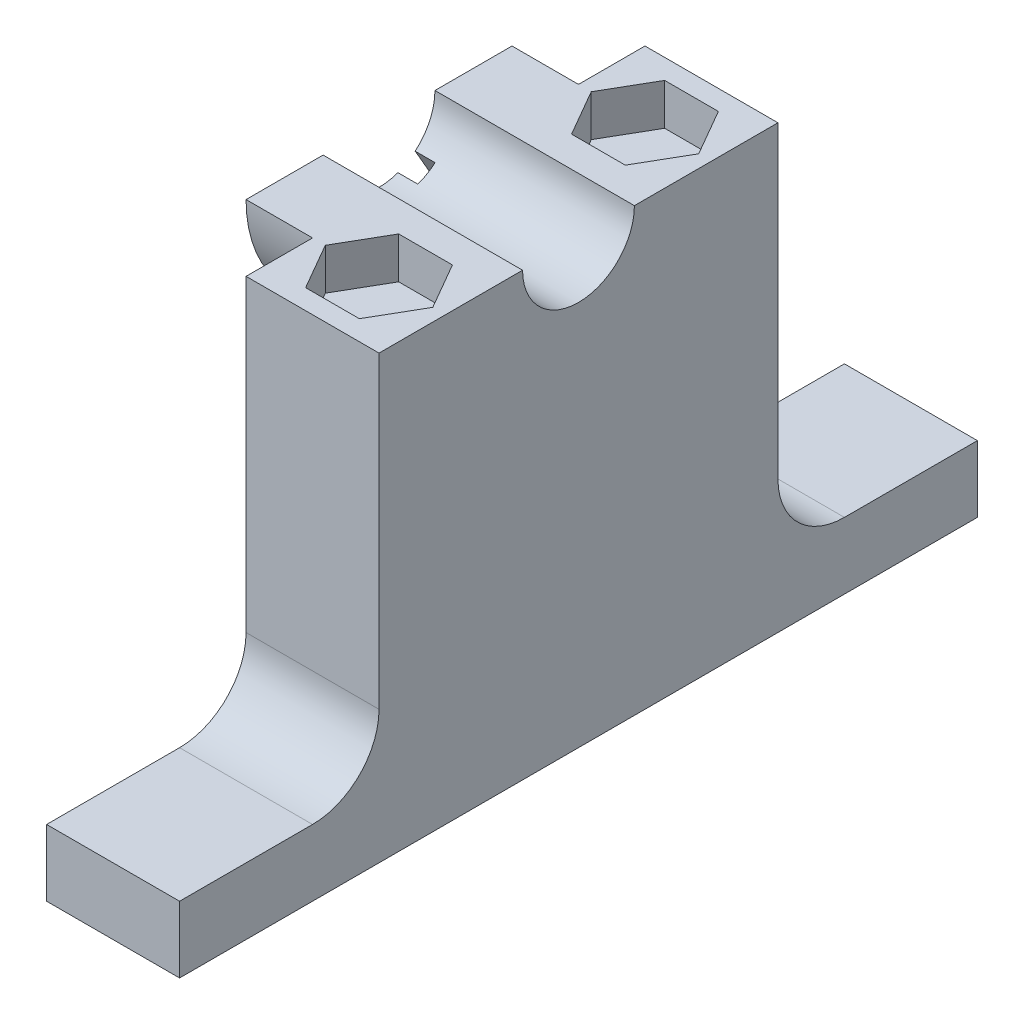
ISO-10303-21;
HEADER;
FILE_DESCRIPTION(('STEP AP214'),'2;1');
FILE_NAME('part.step','',(''),(''),'','','');
FILE_SCHEMA(('AUTOMOTIVE_DESIGN { 1 0 10303 214 1 1 1 1 }'));
ENDSEC;
DATA;
#1=APPLICATION_CONTEXT('core data for automotive mechanical design processes');
#2=APPLICATION_PROTOCOL_DEFINITION('international standard','automotive_design',2000,#1);
#3=PRODUCT_CONTEXT('',#1,'mechanical');
#4=PRODUCT('Part','Part','',(#3));
#5=PRODUCT_RELATED_PRODUCT_CATEGORY('part','',(#4));
#6=PRODUCT_DEFINITION_FORMATION('','',#4);
#7=PRODUCT_DEFINITION_CONTEXT('part definition',#1,'design');
#8=PRODUCT_DEFINITION('design','',#6,#7);
#9=PRODUCT_DEFINITION_SHAPE('','',#8);
#10=(LENGTH_UNIT() NAMED_UNIT(*) SI_UNIT(.MILLI.,.METRE.));
#11=(NAMED_UNIT(*) PLANE_ANGLE_UNIT() SI_UNIT($,.RADIAN.));
#12=(NAMED_UNIT(*) SI_UNIT($,.STERADIAN.) SOLID_ANGLE_UNIT());
#13=UNCERTAINTY_MEASURE_WITH_UNIT(LENGTH_MEASURE(1.E-05),#10,'distance_accuracy_value','');
#14=(GEOMETRIC_REPRESENTATION_CONTEXT(3) GLOBAL_UNCERTAINTY_ASSIGNED_CONTEXT((#13)) GLOBAL_UNIT_ASSIGNED_CONTEXT((#10,
#11,#12)) REPRESENTATION_CONTEXT('',''));
#15=CARTESIAN_POINT('',(0.,0.,0.));
#16=DIRECTION('',(0.,0.,1.));
#17=DIRECTION('',(1.,0.,0.));
#18=AXIS2_PLACEMENT_3D('',#15,#16,#17);
#19=CARTESIAN_POINT('',(5.,33.2,0.));
#20=DIRECTION('',(-1.,0.,0.));
#21=DIRECTION('',(0.,0.,1.));
#22=AXIS2_PLACEMENT_3D('',#19,#20,#21);
#23=CYLINDRICAL_SURFACE('',#22,4.205);
#24=DIRECTION('',(-1.,0.,0.));
#25=VECTOR('',#24,1.);
#26=CARTESIAN_POINT('',(5.,29.991755136751,-2.71830643920743));
#27=LINE('',#26,#25);
#28=CARTESIAN_POINT('',(-8.5,29.991755136751,-2.71830643920743));
#29=VERTEX_POINT('',#28);
#30=CARTESIAN_POINT('',(-10.,29.991755136751,-2.71830643920743));
#31=VERTEX_POINT('',#30);
#32=EDGE_CURVE('E280',#29,#31,#27,.T.);
#33=ORIENTED_EDGE('',*,*,#32,.F.);
#34=CARTESIAN_POINT('',(-8.5,33.2,0.));
#35=DIRECTION('',(1.,0.,0.));
#36=DIRECTION('',(0.,0.,-1.));
#37=AXIS2_PLACEMENT_3D('',#34,#35,#36);
#38=CIRCLE('',#37,4.205);
#39=CARTESIAN_POINT('',(-8.5,29.241755136751,-1.41926833353077));
#40=VERTEX_POINT('',#39);
#41=EDGE_CURVE('E274',#29,#40,#38,.F.);
#42=ORIENTED_EDGE('',*,*,#41,.T.);
#43=DIRECTION('',(-1.,0.,0.));
#44=VECTOR('',#43,1.);
#45=CARTESIAN_POINT('',(5.,29.241755136751,-1.41926833353077));
#46=LINE('',#45,#44);
#47=CARTESIAN_POINT('',(-10.,29.241755136751,-1.41926833353077));
#48=VERTEX_POINT('',#47);
#49=EDGE_CURVE('E260',#40,#48,#46,.T.);
#50=ORIENTED_EDGE('',*,*,#49,.T.);
#51=CARTESIAN_POINT('',(-10.,33.2,0.));
#52=DIRECTION('',(1.,0.,0.));
#53=DIRECTION('',(0.,0.,1.));
#54=AXIS2_PLACEMENT_3D('',#51,#52,#53);
#55=CIRCLE('',#54,4.205);
#56=CARTESIAN_POINT('',(-10.,29.241755136751,1.41926833353078));
#57=VERTEX_POINT('',#56);
#58=EDGE_CURVE('E306',#57,#48,#55,.T.);
#59=ORIENTED_EDGE('',*,*,#58,.F.);
#60=DIRECTION('',(-1.,0.,0.));
#61=VECTOR('',#60,1.);
#62=CARTESIAN_POINT('',(5.,29.241755136751,1.41926833353078));
#63=LINE('',#62,#61);
#64=CARTESIAN_POINT('',(-8.5,29.241755136751,1.41926833353078));
#65=VERTEX_POINT('',#64);
#66=EDGE_CURVE('E296',#65,#57,#63,.T.);
#67=ORIENTED_EDGE('',*,*,#66,.F.);
#68=CARTESIAN_POINT('',(-8.5,33.2,0.));
#69=DIRECTION('',(1.,0.,0.));
#70=DIRECTION('',(0.,0.,-1.));
#71=AXIS2_PLACEMENT_3D('',#68,#69,#70);
#72=CIRCLE('',#71,4.205);
#73=CARTESIAN_POINT('',(-8.5,29.991755136751,2.71830643920744));
#74=VERTEX_POINT('',#73);
#75=EDGE_CURVE('E298',#65,#74,#72,.F.);
#76=ORIENTED_EDGE('',*,*,#75,.T.);
#77=DIRECTION('',(-1.,0.,0.));
#78=VECTOR('',#77,1.);
#79=CARTESIAN_POINT('',(5.,29.991755136751,2.71830643920744));
#80=LINE('',#79,#78);
#81=CARTESIAN_POINT('',(-10.,29.991755136751,2.71830643920744));
#82=VERTEX_POINT('',#81);
#83=EDGE_CURVE('E291',#74,#82,#80,.T.);
#84=ORIENTED_EDGE('',*,*,#83,.T.);
#85=CARTESIAN_POINT('',(-10.,33.2,4.205));
#86=VERTEX_POINT('',#85);
#87=EDGE_CURVE('E302',#86,#82,#55,.T.);
#88=ORIENTED_EDGE('',*,*,#87,.F.);
#89=DIRECTION('',(-1.,0.,0.));
#90=VECTOR('',#89,1.);
#91=CARTESIAN_POINT('',(5.,33.2,4.205));
#92=LINE('',#91,#90);
#93=CARTESIAN_POINT('',(5.,33.2,4.205));
#94=VERTEX_POINT('',#93);
#95=EDGE_CURVE('E482',#94,#86,#92,.T.);
#96=ORIENTED_EDGE('',*,*,#95,.F.);
#97=CARTESIAN_POINT('',(5.,33.2,0.));
#98=DIRECTION('',(-1.,0.,0.));
#99=DIRECTION('',(0.,0.,1.));
#100=AXIS2_PLACEMENT_3D('',#97,#98,#99);
#101=CIRCLE('',#100,4.205);
#102=CARTESIAN_POINT('',(5.,33.2,-4.205));
#103=VERTEX_POINT('',#102);
#104=EDGE_CURVE('E438',#103,#94,#101,.T.);
#105=ORIENTED_EDGE('',*,*,#104,.F.);
#106=DIRECTION('',(-1.,0.,0.));
#107=VECTOR('',#106,1.);
#108=CARTESIAN_POINT('',(5.,33.2,-4.205));
#109=LINE('',#108,#107);
#110=CARTESIAN_POINT('',(-10.,33.2,-4.205));
#111=VERTEX_POINT('',#110);
#112=EDGE_CURVE('E479',#111,#103,#109,.F.);
#113=ORIENTED_EDGE('',*,*,#112,.F.);
#114=EDGE_CURVE('E307',#31,#111,#55,.T.);
#115=ORIENTED_EDGE('',*,*,#114,.F.);
#116=EDGE_LOOP('',(#33,#42,#50,#59,#67,#76,#84,#88,#96,#105,#113,#115));
#117=FACE_BOUND('',#116,.T.);
#118=ADVANCED_FACE('F39',(#117),#23,.F.);
#119=CARTESIAN_POINT('',(-10.,33.2,0.));
#120=DIRECTION('',(1.,0.,0.));
#121=DIRECTION('',(0.,0.,-1.));
#122=AXIS2_PLACEMENT_3D('',#119,#120,#121);
#123=CYLINDRICAL_SURFACE('',#122,10.);
#124=DIRECTION('',(1.,0.,0.));
#125=VECTOR('',#124,1.);
#126=CARTESIAN_POINT('',(-10.,24.939137275292,-5.63543672163306));
#127=LINE('',#126,#125);
#128=CARTESIAN_POINT('',(-10.,24.939137275292,-5.63543672163306));
#129=VERTEX_POINT('',#128);
#130=CARTESIAN_POINT('',(-8.5,24.939137275292,-5.63543672163306));
#131=VERTEX_POINT('',#130);
#132=EDGE_CURVE('E269',#129,#131,#127,.T.);
#133=ORIENTED_EDGE('',*,*,#132,.F.);
#134=CARTESIAN_POINT('',(-10.,33.2,0.));
#135=DIRECTION('',(-1.,0.,0.));
#136=DIRECTION('',(0.,0.,1.));
#137=AXIS2_PLACEMENT_3D('',#134,#135,#136);
#138=CIRCLE('',#137,10.);
#139=CARTESIAN_POINT('',(-10.,33.2,-10.));
#140=VERTEX_POINT('',#139);
#141=EDGE_CURVE('E310',#140,#129,#138,.T.);
#142=ORIENTED_EDGE('',*,*,#141,.F.);
#143=DIRECTION('',(1.,0.,0.));
#144=VECTOR('',#143,1.);
#145=CARTESIAN_POINT('',(-10.,33.2,-10.));
#146=LINE('',#145,#144);
#147=CARTESIAN_POINT('',(-5.,33.2,-10.));
#148=VERTEX_POINT('',#147);
#149=EDGE_CURVE('E322',#140,#148,#146,.T.);
#150=ORIENTED_EDGE('',*,*,#149,.T.);
#151=CARTESIAN_POINT('',(-5.,33.2,0.));
#152=DIRECTION('',(-1.,0.,0.));
#153=DIRECTION('',(0.,0.,1.));
#154=AXIS2_PLACEMENT_3D('',#151,#152,#153);
#155=CIRCLE('',#154,10.);
#156=CARTESIAN_POINT('',(-5.,33.2,10.));
#157=VERTEX_POINT('',#156);
#158=EDGE_CURVE('E301',#148,#157,#155,.T.);
#159=ORIENTED_EDGE('',*,*,#158,.T.);
#160=DIRECTION('',(1.,0.,0.));
#161=VECTOR('',#160,1.);
#162=CARTESIAN_POINT('',(-10.,33.2,10.));
#163=LINE('',#162,#161);
#164=CARTESIAN_POINT('',(-10.,33.2,10.));
#165=VERTEX_POINT('',#164);
#166=EDGE_CURVE('E317',#165,#157,#163,.T.);
#167=ORIENTED_EDGE('',*,*,#166,.F.);
#168=CARTESIAN_POINT('',(-10.,24.939137275292,5.63543672163306));
#169=VERTEX_POINT('',#168);
#170=EDGE_CURVE('E309',#169,#165,#138,.T.);
#171=ORIENTED_EDGE('',*,*,#170,.F.);
#172=DIRECTION('',(1.,0.,0.));
#173=VECTOR('',#172,1.);
#174=CARTESIAN_POINT('',(-10.,24.939137275292,5.63543672163306));
#175=LINE('',#174,#173);
#176=CARTESIAN_POINT('',(-8.5,24.939137275292,5.63543672163307));
#177=VERTEX_POINT('',#176);
#178=EDGE_CURVE('E62',#169,#177,#175,.T.);
#179=ORIENTED_EDGE('',*,*,#178,.T.);
#180=CARTESIAN_POINT('',(-8.5,33.2,0.));
#181=DIRECTION('',(1.,0.,0.));
#182=DIRECTION('',(0.,0.,-1.));
#183=AXIS2_PLACEMENT_3D('',#180,#181,#182);
#184=CIRCLE('',#183,10.);
#185=CARTESIAN_POINT('',(-8.5,24.189137275292,4.3363986159564));
#186=VERTEX_POINT('',#185);
#187=EDGE_CURVE('E507',#177,#186,#184,.T.);
#188=ORIENTED_EDGE('',*,*,#187,.T.);
#189=DIRECTION('',(1.,0.,0.));
#190=VECTOR('',#189,1.);
#191=CARTESIAN_POINT('',(-10.,24.189137275292,4.3363986159564));
#192=LINE('',#191,#190);
#193=CARTESIAN_POINT('',(-10.,24.189137275292,4.33639861595641));
#194=VERTEX_POINT('',#193);
#195=EDGE_CURVE('E294',#194,#186,#192,.T.);
#196=ORIENTED_EDGE('',*,*,#195,.F.);
#197=CARTESIAN_POINT('',(-10.,24.189137275292,-4.3363986159564));
#198=VERTEX_POINT('',#197);
#199=EDGE_CURVE('E314',#198,#194,#138,.T.);
#200=ORIENTED_EDGE('',*,*,#199,.F.);
#201=DIRECTION('',(1.,0.,0.));
#202=VECTOR('',#201,1.);
#203=CARTESIAN_POINT('',(-10.,24.189137275292,-4.3363986159564));
#204=LINE('',#203,#202);
#205=CARTESIAN_POINT('',(-8.5,24.189137275292,-4.3363986159564));
#206=VERTEX_POINT('',#205);
#207=EDGE_CURVE('E54',#198,#206,#204,.T.);
#208=ORIENTED_EDGE('',*,*,#207,.T.);
#209=CARTESIAN_POINT('',(-8.5,33.2,0.));
#210=DIRECTION('',(1.,0.,0.));
#211=DIRECTION('',(0.,0.,-1.));
#212=AXIS2_PLACEMENT_3D('',#209,#210,#211);
#213=CIRCLE('',#212,10.);
#214=EDGE_CURVE('E11',#206,#131,#213,.T.);
#215=ORIENTED_EDGE('',*,*,#214,.T.);
#216=EDGE_LOOP('',(#133,#142,#150,#159,#167,#171,#179,#188,#196,#200,#208,#215));
#217=FACE_BOUND('',#216,.T.);
#218=ADVANCED_FACE('F531',(#217),#123,.T.);
#219=CARTESIAN_POINT('',(-10.,33.2,0.));
#220=DIRECTION('',(-1.,0.,0.));
#221=DIRECTION('',(0.,0.,1.));
#222=AXIS2_PLACEMENT_3D('',#219,#220,#221);
#223=PLANE('',#222);
#224=ORIENTED_EDGE('',*,*,#141,.T.);
#225=DIRECTION('',(0.,0.866025403784442,0.499999999999995));
#226=VECTOR('',#225,1.);
#227=CARTESIAN_POINT('',(-10.,33.575,-0.64951905283833));
#228=LINE('',#227,#226);
#229=EDGE_CURVE('E47',#129,#31,#228,.T.);
#230=ORIENTED_EDGE('',*,*,#229,.T.);
#231=ORIENTED_EDGE('',*,*,#114,.T.);
#232=DIRECTION('',(0.,0.,-1.));
#233=VECTOR('',#232,1.);
#234=CARTESIAN_POINT('',(-10.,33.2,-10.));
#235=LINE('',#234,#233);
#236=EDGE_CURVE('E305',#111,#140,#235,.T.);
#237=ORIENTED_EDGE('',*,*,#236,.T.);
#238=EDGE_LOOP('',(#224,#230,#231,#237));
#239=FACE_BOUND('',#238,.T.);
#240=ADVANCED_FACE('F512',(#239),#223,.T.);
#241=DIRECTION('',(0.,0.866025403784442,0.499999999999995));
#242=VECTOR('',#241,1.);
#243=CARTESIAN_POINT('',(-10.,32.825,0.64951905283833));
#244=LINE('',#243,#242);
#245=EDGE_CURVE('E264',#198,#48,#244,.T.);
#246=ORIENTED_EDGE('',*,*,#245,.F.);
#247=ORIENTED_EDGE('',*,*,#199,.T.);
#248=DIRECTION('',(0.,0.866025403784442,-0.499999999999995));
#249=VECTOR('',#248,1.);
#250=CARTESIAN_POINT('',(-10.,32.825,-0.64951905283833));
#251=LINE('',#250,#249);
#252=EDGE_CURVE('E504',#194,#57,#251,.T.);
#253=ORIENTED_EDGE('',*,*,#252,.T.);
#254=ORIENTED_EDGE('',*,*,#58,.T.);
#255=EDGE_LOOP('',(#246,#247,#253,#254));
#256=FACE_BOUND('',#255,.T.);
#257=ADVANCED_FACE('F519',(#256),#223,.T.);
#258=CARTESIAN_POINT('',(0.,33.2,0.));
#259=DIRECTION('',(0.,-1.,0.));
#260=DIRECTION('',(0.,0.,-1.));
#261=AXIS2_PLACEMENT_3D('',#258,#259,#260);
#262=PLANE('',#261);
#263=DIRECTION('',(0.,0.,-1.));
#264=VECTOR('',#263,1.);
#265=CARTESIAN_POINT('',(5.,33.2,15.));
#266=LINE('',#265,#264);
#267=CARTESIAN_POINT('',(5.,33.2,15.));
#268=VERTEX_POINT('',#267);
#269=EDGE_CURVE('E459',#268,#94,#266,.T.);
#270=ORIENTED_EDGE('',*,*,#269,.T.);
#271=ORIENTED_EDGE('',*,*,#95,.T.);
#272=DIRECTION('',(0.,0.,-1.));
#273=VECTOR('',#272,1.);
#274=CARTESIAN_POINT('',(-10.,33.2,4.205));
#275=LINE('',#274,#273);
#276=EDGE_CURVE('E313',#165,#86,#275,.T.);
#277=ORIENTED_EDGE('',*,*,#276,.F.);
#278=ORIENTED_EDGE('',*,*,#166,.T.);
#279=DIRECTION('',(0.,0.,1.));
#280=VECTOR('',#279,1.);
#281=CARTESIAN_POINT('',(-5.,33.2,15.));
#282=LINE('',#281,#280);
#283=CARTESIAN_POINT('',(-5.,33.2,15.));
#284=VERTEX_POINT('',#283);
#285=EDGE_CURVE('E456',#157,#284,#282,.T.);
#286=ORIENTED_EDGE('',*,*,#285,.T.);
#287=DIRECTION('',(1.,0.,0.));
#288=VECTOR('',#287,1.);
#289=CARTESIAN_POINT('',(-5.,33.2,15.));
#290=LINE('',#289,#288);
#291=EDGE_CURVE('E455',#284,#268,#290,.T.);
#292=ORIENTED_EDGE('',*,*,#291,.T.);
#293=EDGE_LOOP('',(#270,#271,#277,#278,#286,#292));
#294=FACE_BOUND('',#293,.T.);
#295=DIRECTION('',(1.,0.,0.));
#296=VECTOR('',#295,1.);
#297=CARTESIAN_POINT('',(-2.02072594216369,33.2,6.5));
#298=LINE('',#297,#296);
#299=CARTESIAN_POINT('',(-2.02072594216369,33.2,6.5));
#300=VERTEX_POINT('',#299);
#301=CARTESIAN_POINT('',(2.02072594216369,33.2,6.5));
#302=VERTEX_POINT('',#301);
#303=EDGE_CURVE('E336',#300,#302,#298,.T.);
#304=ORIENTED_EDGE('',*,*,#303,.T.);
#305=DIRECTION('',(0.5,0.,0.866025403784439));
#306=VECTOR('',#305,1.);
#307=CARTESIAN_POINT('',(2.02072594216369,33.2,6.5));
#308=LINE('',#307,#306);
#309=CARTESIAN_POINT('',(4.04145188432738,33.2,10.));
#310=VERTEX_POINT('',#309);
#311=EDGE_CURVE('E360',#302,#310,#308,.T.);
#312=ORIENTED_EDGE('',*,*,#311,.T.);
#313=DIRECTION('',(-0.5,0.,0.866025403784439));
#314=VECTOR('',#313,1.);
#315=CARTESIAN_POINT('',(4.04145188432738,33.2,10.));
#316=LINE('',#315,#314);
#317=CARTESIAN_POINT('',(2.02072594216369,33.2,13.5));
#318=VERTEX_POINT('',#317);
#319=EDGE_CURVE('E382',#310,#318,#316,.T.);
#320=ORIENTED_EDGE('',*,*,#319,.T.);
#321=DIRECTION('',(-1.,0.,0.));
#322=VECTOR('',#321,1.);
#323=CARTESIAN_POINT('',(2.02072594216369,33.2,13.5));
#324=LINE('',#323,#322);
#325=CARTESIAN_POINT('',(-2.02072594216369,33.2,13.5));
#326=VERTEX_POINT('',#325);
#327=EDGE_CURVE('E379',#318,#326,#324,.T.);
#328=ORIENTED_EDGE('',*,*,#327,.T.);
#329=DIRECTION('',(-0.5,0.,-0.866025403784439));
#330=VECTOR('',#329,1.);
#331=CARTESIAN_POINT('',(-2.02072594216369,33.2,13.5));
#332=LINE('',#331,#330);
#333=CARTESIAN_POINT('',(-4.04145188432738,33.2,10.));
#334=VERTEX_POINT('',#333);
#335=EDGE_CURVE('E376',#326,#334,#332,.T.);
#336=ORIENTED_EDGE('',*,*,#335,.T.);
#337=DIRECTION('',(0.5,0.,-0.866025403784439));
#338=VECTOR('',#337,1.);
#339=CARTESIAN_POINT('',(-4.04145188432738,33.2,10.));
#340=LINE('',#339,#338);
#341=EDGE_CURVE('E373',#334,#300,#340,.T.);
#342=ORIENTED_EDGE('',*,*,#341,.T.);
#343=EDGE_LOOP('',(#304,#312,#320,#328,#336,#342));
#344=FACE_BOUND('',#343,.T.);
#345=ADVANCED_FACE('F550',(#294,#344),#262,.F.);
#346=CARTESIAN_POINT('',(-5.,33.2,15.));
#347=DIRECTION('',(1.,0.,0.));
#348=DIRECTION('',(0.,0.,-1.));
#349=AXIS2_PLACEMENT_3D('',#346,#347,#348);
#350=PLANE('',#349);
#351=ORIENTED_EDGE('',*,*,#158,.F.);
#352=CARTESIAN_POINT('',(-5.,33.2,-15.));
#353=VERTEX_POINT('',#352);
#354=EDGE_CURVE('E452',#353,#148,#282,.T.);
#355=ORIENTED_EDGE('',*,*,#354,.F.);
#356=DIRECTION('',(0.,-1.,0.));
#357=VECTOR('',#356,1.);
#358=CARTESIAN_POINT('',(-5.,33.2,-15.));
#359=LINE('',#358,#357);
#360=CARTESIAN_POINT('',(-5.,10.,-15.));
#361=VERTEX_POINT('',#360);
#362=EDGE_CURVE('E464',#353,#361,#359,.T.);
#363=ORIENTED_EDGE('',*,*,#362,.T.);
#364=CARTESIAN_POINT('',(-5.,10.,-20.));
#365=DIRECTION('',(1.,0.,0.));
#366=DIRECTION('',(0.,0.,-1.));
#367=AXIS2_PLACEMENT_3D('',#364,#365,#366);
#368=CIRCLE('',#367,5.);
#369=CARTESIAN_POINT('',(-5.,5.00000000000001,-20.));
#370=VERTEX_POINT('',#369);
#371=EDGE_CURVE('E494',#361,#370,#368,.T.);
#372=ORIENTED_EDGE('',*,*,#371,.T.);
#373=DIRECTION('',(0.,0.,-1.));
#374=VECTOR('',#373,1.);
#375=CARTESIAN_POINT('',(-5.,5.,30.));
#376=LINE('',#375,#374);
#377=CARTESIAN_POINT('',(-5.,5.00000000000001,-30.));
#378=VERTEX_POINT('',#377);
#379=EDGE_CURVE('E329',#370,#378,#376,.T.);
#380=ORIENTED_EDGE('',*,*,#379,.T.);
#381=DIRECTION('',(0.,-1.,0.));
#382=VECTOR('',#381,1.);
#383=CARTESIAN_POINT('',(-5.,0.,-30.));
#384=LINE('',#383,#382);
#385=CARTESIAN_POINT('',(-5.,0.,-30.));
#386=VERTEX_POINT('',#385);
#387=EDGE_CURVE('E326',#378,#386,#384,.T.);
#388=ORIENTED_EDGE('',*,*,#387,.T.);
#389=DIRECTION('',(0.,0.,1.));
#390=VECTOR('',#389,1.);
#391=CARTESIAN_POINT('',(-5.,0.,15.));
#392=LINE('',#391,#390);
#393=CARTESIAN_POINT('',(-5.,0.,30.));
#394=VERTEX_POINT('',#393);
#395=EDGE_CURVE('E451',#386,#394,#392,.T.);
#396=ORIENTED_EDGE('',*,*,#395,.T.);
#397=DIRECTION('',(0.,1.,0.));
#398=VECTOR('',#397,1.);
#399=CARTESIAN_POINT('',(-5.,0.,30.));
#400=LINE('',#399,#398);
#401=CARTESIAN_POINT('',(-5.,5.,30.));
#402=VERTEX_POINT('',#401);
#403=EDGE_CURVE('E334',#394,#402,#400,.T.);
#404=ORIENTED_EDGE('',*,*,#403,.T.);
#405=CARTESIAN_POINT('',(-5.,5.,20.));
#406=VERTEX_POINT('',#405);
#407=EDGE_CURVE('E331',#402,#406,#376,.T.);
#408=ORIENTED_EDGE('',*,*,#407,.T.);
#409=CARTESIAN_POINT('',(-5.,10.,20.));
#410=DIRECTION('',(1.,0.,0.));
#411=DIRECTION('',(0.,0.,-1.));
#412=AXIS2_PLACEMENT_3D('',#409,#410,#411);
#413=CIRCLE('',#412,5.);
#414=CARTESIAN_POINT('',(-5.,10.,15.));
#415=VERTEX_POINT('',#414);
#416=EDGE_CURVE('E500',#406,#415,#413,.T.);
#417=ORIENTED_EDGE('',*,*,#416,.T.);
#418=DIRECTION('',(0.,-1.,0.));
#419=VECTOR('',#418,1.);
#420=CARTESIAN_POINT('',(-5.,33.2,15.));
#421=LINE('',#420,#419);
#422=EDGE_CURVE('E476',#284,#415,#421,.T.);
#423=ORIENTED_EDGE('',*,*,#422,.F.);
#424=ORIENTED_EDGE('',*,*,#285,.F.);
#425=EDGE_LOOP('',(#351,#355,#363,#372,#380,#388,#396,#404,#408,#417,#423,#424));
#426=FACE_BOUND('',#425,.T.);
#427=ADVANCED_FACE('F546',(#426),#350,.F.);
#428=CARTESIAN_POINT('',(-5.,33.2,15.));
#429=DIRECTION('',(0.,0.,-1.));
#430=DIRECTION('',(-1.,0.,0.));
#431=AXIS2_PLACEMENT_3D('',#428,#429,#430);
#432=PLANE('',#431);
#433=ORIENTED_EDGE('',*,*,#422,.T.);
#434=DIRECTION('',(1.,0.,0.));
#435=VECTOR('',#434,1.);
#436=CARTESIAN_POINT('',(-5.,10.,15.));
#437=LINE('',#436,#435);
#438=CARTESIAN_POINT('',(5.,10.,15.));
#439=VERTEX_POINT('',#438);
#440=EDGE_CURVE('E489',#415,#439,#437,.T.);
#441=ORIENTED_EDGE('',*,*,#440,.T.);
#442=DIRECTION('',(0.,-1.,0.));
#443=VECTOR('',#442,1.);
#444=CARTESIAN_POINT('',(5.,33.2,15.));
#445=LINE('',#444,#443);
#446=EDGE_CURVE('E473',#268,#439,#445,.T.);
#447=ORIENTED_EDGE('',*,*,#446,.F.);
#448=ORIENTED_EDGE('',*,*,#291,.F.);
#449=EDGE_LOOP('',(#433,#441,#447,#448));
#450=FACE_BOUND('',#449,.T.);
#451=ADVANCED_FACE('F554',(#450),#432,.F.);
#452=CARTESIAN_POINT('',(5.,33.2,15.));
#453=DIRECTION('',(-1.,0.,0.));
#454=DIRECTION('',(0.,0.,1.));
#455=AXIS2_PLACEMENT_3D('',#452,#453,#454);
#456=PLANE('',#455);
#457=ORIENTED_EDGE('',*,*,#446,.T.);
#458=CARTESIAN_POINT('',(5.,10.,20.));
#459=DIRECTION('',(-1.,0.,0.));
#460=DIRECTION('',(0.,0.,1.));
#461=AXIS2_PLACEMENT_3D('',#458,#459,#460);
#462=CIRCLE('',#461,5.);
#463=CARTESIAN_POINT('',(5.,5.,20.));
#464=VERTEX_POINT('',#463);
#465=EDGE_CURVE('E498',#439,#464,#462,.T.);
#466=ORIENTED_EDGE('',*,*,#465,.T.);
#467=DIRECTION('',(0.,0.,1.));
#468=VECTOR('',#467,1.);
#469=CARTESIAN_POINT('',(5.,5.,30.));
#470=LINE('',#469,#468);
#471=CARTESIAN_POINT('',(5.,5.,30.));
#472=VERTEX_POINT('',#471);
#473=EDGE_CURVE('E342',#464,#472,#470,.T.);
#474=ORIENTED_EDGE('',*,*,#473,.T.);
#475=DIRECTION('',(0.,-1.,0.));
#476=VECTOR('',#475,1.);
#477=CARTESIAN_POINT('',(5.,0.,30.));
#478=LINE('',#477,#476);
#479=CARTESIAN_POINT('',(5.,0.,30.));
#480=VERTEX_POINT('',#479);
#481=EDGE_CURVE('E325',#472,#480,#478,.T.);
#482=ORIENTED_EDGE('',*,*,#481,.T.);
#483=DIRECTION('',(0.,0.,-1.));
#484=VECTOR('',#483,1.);
#485=CARTESIAN_POINT('',(5.,0.,15.));
#486=LINE('',#485,#484);
#487=CARTESIAN_POINT('',(5.,0.,-30.));
#488=VERTEX_POINT('',#487);
#489=EDGE_CURVE('E466',#480,#488,#486,.T.);
#490=ORIENTED_EDGE('',*,*,#489,.T.);
#491=DIRECTION('',(0.,1.,0.));
#492=VECTOR('',#491,1.);
#493=CARTESIAN_POINT('',(5.,0.,-30.));
#494=LINE('',#493,#492);
#495=CARTESIAN_POINT('',(5.,5.00000000000001,-30.));
#496=VERTEX_POINT('',#495);
#497=EDGE_CURVE('E339',#488,#496,#494,.T.);
#498=ORIENTED_EDGE('',*,*,#497,.T.);
#499=CARTESIAN_POINT('',(5.,5.00000000000001,-20.));
#500=VERTEX_POINT('',#499);
#501=EDGE_CURVE('E343',#496,#500,#470,.T.);
#502=ORIENTED_EDGE('',*,*,#501,.T.);
#503=CARTESIAN_POINT('',(5.,10.,-20.));
#504=DIRECTION('',(-1.,0.,0.));
#505=DIRECTION('',(0.,0.,1.));
#506=AXIS2_PLACEMENT_3D('',#503,#504,#505);
#507=CIRCLE('',#506,5.);
#508=CARTESIAN_POINT('',(5.,10.,-15.));
#509=VERTEX_POINT('',#508);
#510=EDGE_CURVE('E496',#500,#509,#507,.T.);
#511=ORIENTED_EDGE('',*,*,#510,.T.);
#512=DIRECTION('',(0.,-1.,0.));
#513=VECTOR('',#512,1.);
#514=CARTESIAN_POINT('',(5.,33.2,-15.));
#515=LINE('',#514,#513);
#516=CARTESIAN_POINT('',(5.,33.2,-15.));
#517=VERTEX_POINT('',#516);
#518=EDGE_CURVE('E470',#517,#509,#515,.T.);
#519=ORIENTED_EDGE('',*,*,#518,.F.);
#520=EDGE_CURVE('E458',#103,#517,#266,.T.);
#521=ORIENTED_EDGE('',*,*,#520,.F.);
#522=ORIENTED_EDGE('',*,*,#104,.T.);
#523=ORIENTED_EDGE('',*,*,#269,.F.);
#524=EDGE_LOOP('',(#457,#466,#474,#482,#490,#498,#502,#511,#519,#521,#522,#523));
#525=FACE_BOUND('',#524,.T.);
#526=ADVANCED_FACE('F558',(#525),#456,.F.);
#527=CARTESIAN_POINT('',(-5.,33.2,-15.));
#528=DIRECTION('',(0.,0.,1.));
#529=DIRECTION('',(1.,0.,0.));
#530=AXIS2_PLACEMENT_3D('',#527,#528,#529);
#531=PLANE('',#530);
#532=ORIENTED_EDGE('',*,*,#518,.T.);
#533=DIRECTION('',(-1.,0.,0.));
#534=VECTOR('',#533,1.);
#535=CARTESIAN_POINT('',(-5.,10.,-15.));
#536=LINE('',#535,#534);
#537=EDGE_CURVE('E484',#509,#361,#536,.T.);
#538=ORIENTED_EDGE('',*,*,#537,.T.);
#539=ORIENTED_EDGE('',*,*,#362,.F.);
#540=DIRECTION('',(-1.,0.,0.));
#541=VECTOR('',#540,1.);
#542=CARTESIAN_POINT('',(-5.,33.2,-15.));
#543=LINE('',#542,#541);
#544=EDGE_CURVE('E462',#517,#353,#543,.T.);
#545=ORIENTED_EDGE('',*,*,#544,.F.);
#546=EDGE_LOOP('',(#532,#538,#539,#545));
#547=FACE_BOUND('',#546,.T.);
#548=ADVANCED_FACE('F585',(#547),#531,.F.);
#549=DIRECTION('',(0.5,0.,-0.866025403784439));
#550=VECTOR('',#549,1.);
#551=CARTESIAN_POINT('',(2.02072594216369,33.2,-6.5));
#552=LINE('',#551,#550);
#553=CARTESIAN_POINT('',(2.02072594216369,33.2,-6.5));
#554=VERTEX_POINT('',#553);
#555=CARTESIAN_POINT('',(4.04145188432738,33.2,-10.));
#556=VERTEX_POINT('',#555);
#557=EDGE_CURVE('E422',#554,#556,#552,.T.);
#558=ORIENTED_EDGE('',*,*,#557,.F.);
#559=DIRECTION('',(1.,0.,0.));
#560=VECTOR('',#559,1.);
#561=CARTESIAN_POINT('',(-2.02072594216369,33.2,-6.5));
#562=LINE('',#561,#560);
#563=CARTESIAN_POINT('',(-2.02072594216369,33.2,-6.5));
#564=VERTEX_POINT('',#563);
#565=EDGE_CURVE('E390',#564,#554,#562,.T.);
#566=ORIENTED_EDGE('',*,*,#565,.F.);
#567=DIRECTION('',(0.5,0.,0.866025403784439));
#568=VECTOR('',#567,1.);
#569=CARTESIAN_POINT('',(-4.04145188432738,33.2,-10.));
#570=LINE('',#569,#568);
#571=CARTESIAN_POINT('',(-4.04145188432738,33.2,-10.));
#572=VERTEX_POINT('',#571);
#573=EDGE_CURVE('E405',#572,#564,#570,.T.);
#574=ORIENTED_EDGE('',*,*,#573,.F.);
#575=DIRECTION('',(-0.5,0.,0.866025403784439));
#576=VECTOR('',#575,1.);
#577=CARTESIAN_POINT('',(-2.02072594216369,33.2,-13.5));
#578=LINE('',#577,#576);
#579=CARTESIAN_POINT('',(-2.02072594216369,33.2,-13.5));
#580=VERTEX_POINT('',#579);
#581=EDGE_CURVE('E431',#580,#572,#578,.T.);
#582=ORIENTED_EDGE('',*,*,#581,.F.);
#583=DIRECTION('',(-1.,0.,0.));
#584=VECTOR('',#583,1.);
#585=CARTESIAN_POINT('',(2.02072594216369,33.2,-13.5));
#586=LINE('',#585,#584);
#587=CARTESIAN_POINT('',(2.02072594216369,33.2,-13.5));
#588=VERTEX_POINT('',#587);
#589=EDGE_CURVE('E428',#588,#580,#586,.T.);
#590=ORIENTED_EDGE('',*,*,#589,.F.);
#591=DIRECTION('',(-0.5,0.,-0.866025403784439));
#592=VECTOR('',#591,1.);
#593=CARTESIAN_POINT('',(4.04145188432738,33.2,-10.));
#594=LINE('',#593,#592);
#595=EDGE_CURVE('E425',#556,#588,#594,.T.);
#596=ORIENTED_EDGE('',*,*,#595,.F.);
#597=EDGE_LOOP('',(#558,#566,#574,#582,#590,#596));
#598=FACE_BOUND('',#597,.T.);
#599=ORIENTED_EDGE('',*,*,#354,.T.);
#600=ORIENTED_EDGE('',*,*,#149,.F.);
#601=ORIENTED_EDGE('',*,*,#236,.F.);
#602=ORIENTED_EDGE('',*,*,#112,.T.);
#603=ORIENTED_EDGE('',*,*,#520,.T.);
#604=ORIENTED_EDGE('',*,*,#544,.T.);
#605=EDGE_LOOP('',(#599,#600,#601,#602,#603,#604));
#606=FACE_BOUND('',#605,.T.);
#607=ADVANCED_FACE('F541',(#598,#606),#262,.F.);
#608=CARTESIAN_POINT('',(0.,0.,0.));
#609=DIRECTION('',(0.,-1.,0.));
#610=DIRECTION('',(0.,0.,-1.));
#611=AXIS2_PLACEMENT_3D('',#608,#609,#610);
#612=PLANE('',#611);
#613=ORIENTED_EDGE('',*,*,#395,.F.);
#614=DIRECTION('',(1.,0.,0.));
#615=VECTOR('',#614,1.);
#616=CARTESIAN_POINT('',(-65.2079728939615,0.,-30.));
#617=LINE('',#616,#615);
#618=EDGE_CURVE('E351',#386,#488,#617,.T.);
#619=ORIENTED_EDGE('',*,*,#618,.T.);
#620=ORIENTED_EDGE('',*,*,#489,.F.);
#621=DIRECTION('',(1.,0.,0.));
#622=VECTOR('',#621,1.);
#623=CARTESIAN_POINT('',(-65.2079728939615,0.,30.));
#624=LINE('',#623,#622);
#625=EDGE_CURVE('E346',#394,#480,#624,.T.);
#626=ORIENTED_EDGE('',*,*,#625,.F.);
#627=EDGE_LOOP('',(#613,#619,#620,#626));
#628=FACE_BOUND('',#627,.T.);
#629=ADVANCED_FACE('F584',(#628),#612,.T.);
#630=CARTESIAN_POINT('',(-2.02072594216369,30.08,-6.5));
#631=DIRECTION('',(0.,0.,1.));
#632=DIRECTION('',(1.,0.,0.));
#633=AXIS2_PLACEMENT_3D('',#630,#631,#632);
#634=PLANE('',#633);
#635=ORIENTED_EDGE('',*,*,#565,.T.);
#636=DIRECTION('',(0.,1.,0.));
#637=VECTOR('',#636,1.);
#638=CARTESIAN_POINT('',(2.02072594216369,30.08,-6.5));
#639=LINE('',#638,#637);
#640=CARTESIAN_POINT('',(2.02072594216369,30.08,-6.5));
#641=VERTEX_POINT('',#640);
#642=EDGE_CURVE('E420',#641,#554,#639,.T.);
#643=ORIENTED_EDGE('',*,*,#642,.F.);
#644=DIRECTION('',(1.,0.,0.));
#645=VECTOR('',#644,1.);
#646=CARTESIAN_POINT('',(-2.02072594216369,30.08,-6.5));
#647=LINE('',#646,#645);
#648=CARTESIAN_POINT('',(-2.02072594216369,30.08,-6.5));
#649=VERTEX_POINT('',#648);
#650=EDGE_CURVE('E401',#649,#641,#647,.T.);
#651=ORIENTED_EDGE('',*,*,#650,.F.);
#652=DIRECTION('',(0.,1.,0.));
#653=VECTOR('',#652,1.);
#654=CARTESIAN_POINT('',(-2.02072594216369,30.08,-6.5));
#655=LINE('',#654,#653);
#656=EDGE_CURVE('E436',#649,#564,#655,.T.);
#657=ORIENTED_EDGE('',*,*,#656,.T.);
#658=EDGE_LOOP('',(#635,#643,#651,#657));
#659=FACE_BOUND('',#658,.T.);
#660=ADVANCED_FACE('F580',(#659),#634,.F.);
#661=CARTESIAN_POINT('',(-4.04145188432738,30.08,-10.));
#662=DIRECTION('',(-0.866025403784439,0.,0.5));
#663=DIRECTION('',(0.5,0.,0.866025403784439));
#664=AXIS2_PLACEMENT_3D('',#661,#662,#663);
#665=PLANE('',#664);
#666=ORIENTED_EDGE('',*,*,#573,.T.);
#667=ORIENTED_EDGE('',*,*,#656,.F.);
#668=DIRECTION('',(0.5,0.,0.866025403784439));
#669=VECTOR('',#668,1.);
#670=CARTESIAN_POINT('',(-4.04145188432738,30.08,-10.));
#671=LINE('',#670,#669);
#672=CARTESIAN_POINT('',(-4.04145188432738,30.08,-10.));
#673=VERTEX_POINT('',#672);
#674=EDGE_CURVE('E417',#673,#649,#671,.T.);
#675=ORIENTED_EDGE('',*,*,#674,.F.);
#676=DIRECTION('',(0.,1.,0.));
#677=VECTOR('',#676,1.);
#678=CARTESIAN_POINT('',(-4.04145188432738,30.08,-10.));
#679=LINE('',#678,#677);
#680=EDGE_CURVE('E439',#673,#572,#679,.T.);
#681=ORIENTED_EDGE('',*,*,#680,.T.);
#682=EDGE_LOOP('',(#666,#667,#675,#681));
#683=FACE_BOUND('',#682,.T.);
#684=ADVANCED_FACE('F675',(#683),#665,.F.);
#685=CARTESIAN_POINT('',(-2.02072594216369,30.08,-13.5));
#686=DIRECTION('',(-0.866025403784439,0.,-0.5));
#687=DIRECTION('',(-0.5,0.,0.866025403784439));
#688=AXIS2_PLACEMENT_3D('',#685,#686,#687);
#689=PLANE('',#688);
#690=ORIENTED_EDGE('',*,*,#581,.T.);
#691=ORIENTED_EDGE('',*,*,#680,.F.);
#692=DIRECTION('',(-0.5,0.,0.866025403784439));
#693=VECTOR('',#692,1.);
#694=CARTESIAN_POINT('',(-2.02072594216369,30.08,-13.5));
#695=LINE('',#694,#693);
#696=CARTESIAN_POINT('',(-2.02072594216369,30.08,-13.5));
#697=VERTEX_POINT('',#696);
#698=EDGE_CURVE('E414',#697,#673,#695,.T.);
#699=ORIENTED_EDGE('',*,*,#698,.F.);
#700=DIRECTION('',(0.,1.,0.));
#701=VECTOR('',#700,1.);
#702=CARTESIAN_POINT('',(-2.02072594216369,30.08,-13.5));
#703=LINE('',#702,#701);
#704=EDGE_CURVE('E441',#697,#580,#703,.T.);
#705=ORIENTED_EDGE('',*,*,#704,.T.);
#706=EDGE_LOOP('',(#690,#691,#699,#705));
#707=FACE_BOUND('',#706,.T.);
#708=ADVANCED_FACE('F678',(#707),#689,.F.);
#709=CARTESIAN_POINT('',(2.02072594216369,30.08,-13.5));
#710=DIRECTION('',(0.,0.,-1.));
#711=DIRECTION('',(-1.,0.,0.));
#712=AXIS2_PLACEMENT_3D('',#709,#710,#711);
#713=PLANE('',#712);
#714=ORIENTED_EDGE('',*,*,#589,.T.);
#715=ORIENTED_EDGE('',*,*,#704,.F.);
#716=DIRECTION('',(-1.,0.,0.));
#717=VECTOR('',#716,1.);
#718=CARTESIAN_POINT('',(2.02072594216369,30.08,-13.5));
#719=LINE('',#718,#717);
#720=CARTESIAN_POINT('',(2.02072594216369,30.08,-13.5));
#721=VERTEX_POINT('',#720);
#722=EDGE_CURVE('E411',#721,#697,#719,.T.);
#723=ORIENTED_EDGE('',*,*,#722,.F.);
#724=DIRECTION('',(0.,1.,0.));
#725=VECTOR('',#724,1.);
#726=CARTESIAN_POINT('',(2.02072594216369,30.08,-13.5));
#727=LINE('',#726,#725);
#728=EDGE_CURVE('E443',#721,#588,#727,.T.);
#729=ORIENTED_EDGE('',*,*,#728,.T.);
#730=EDGE_LOOP('',(#714,#715,#723,#729));
#731=FACE_BOUND('',#730,.T.);
#732=ADVANCED_FACE('F682',(#731),#713,.F.);
#733=CARTESIAN_POINT('',(4.04145188432738,30.08,-10.));
#734=DIRECTION('',(0.866025403784439,0.,-0.5));
#735=DIRECTION('',(-0.5,0.,-0.866025403784439));
#736=AXIS2_PLACEMENT_3D('',#733,#734,#735);
#737=PLANE('',#736);
#738=ORIENTED_EDGE('',*,*,#595,.T.);
#739=ORIENTED_EDGE('',*,*,#728,.F.);
#740=DIRECTION('',(-0.5,0.,-0.866025403784439));
#741=VECTOR('',#740,1.);
#742=CARTESIAN_POINT('',(4.04145188432738,30.08,-10.));
#743=LINE('',#742,#741);
#744=CARTESIAN_POINT('',(4.04145188432738,30.08,-10.));
#745=VERTEX_POINT('',#744);
#746=EDGE_CURVE('E408',#745,#721,#743,.T.);
#747=ORIENTED_EDGE('',*,*,#746,.F.);
#748=DIRECTION('',(0.,1.,0.));
#749=VECTOR('',#748,1.);
#750=CARTESIAN_POINT('',(4.04145188432738,30.08,-10.));
#751=LINE('',#750,#749);
#752=EDGE_CURVE('E445',#745,#556,#751,.T.);
#753=ORIENTED_EDGE('',*,*,#752,.T.);
#754=EDGE_LOOP('',(#738,#739,#747,#753));
#755=FACE_BOUND('',#754,.T.);
#756=ADVANCED_FACE('F686',(#755),#737,.F.);
#757=CARTESIAN_POINT('',(2.02072594216369,30.08,-6.5));
#758=DIRECTION('',(0.866025403784439,0.,0.5));
#759=DIRECTION('',(0.5,0.,-0.866025403784439));
#760=AXIS2_PLACEMENT_3D('',#757,#758,#759);
#761=PLANE('',#760);
#762=ORIENTED_EDGE('',*,*,#557,.T.);
#763=ORIENTED_EDGE('',*,*,#752,.F.);
#764=DIRECTION('',(0.5,0.,-0.866025403784439));
#765=VECTOR('',#764,1.);
#766=CARTESIAN_POINT('',(2.02072594216369,30.08,-6.5));
#767=LINE('',#766,#765);
#768=EDGE_CURVE('E404',#641,#745,#767,.T.);
#769=ORIENTED_EDGE('',*,*,#768,.F.);
#770=ORIENTED_EDGE('',*,*,#642,.T.);
#771=EDGE_LOOP('',(#762,#763,#769,#770));
#772=FACE_BOUND('',#771,.T.);
#773=ADVANCED_FACE('F673',(#772),#761,.F.);
#774=CARTESIAN_POINT('',(0.,30.08,0.));
#775=DIRECTION('',(0.,1.,0.));
#776=DIRECTION('',(0.,0.,1.));
#777=AXIS2_PLACEMENT_3D('',#774,#775,#776);
#778=PLANE('',#777);
#779=ORIENTED_EDGE('',*,*,#650,.T.);
#780=ORIENTED_EDGE('',*,*,#768,.T.);
#781=ORIENTED_EDGE('',*,*,#746,.T.);
#782=ORIENTED_EDGE('',*,*,#722,.T.);
#783=ORIENTED_EDGE('',*,*,#698,.T.);
#784=ORIENTED_EDGE('',*,*,#674,.T.);
#785=EDGE_LOOP('',(#779,#780,#781,#782,#783,#784));
#786=FACE_BOUND('',#785,.T.);
#787=ADVANCED_FACE('F669',(#786),#778,.T.);
#788=CARTESIAN_POINT('',(-2.02072594216369,30.08,6.5));
#789=DIRECTION('',(0.,0.,1.));
#790=DIRECTION('',(1.,0.,0.));
#791=AXIS2_PLACEMENT_3D('',#788,#789,#790);
#792=PLANE('',#791);
#793=ORIENTED_EDGE('',*,*,#303,.F.);
#794=DIRECTION('',(0.,1.,0.));
#795=VECTOR('',#794,1.);
#796=CARTESIAN_POINT('',(-2.02072594216369,30.08,6.5));
#797=LINE('',#796,#795);
#798=CARTESIAN_POINT('',(-2.02072594216369,30.08,6.5));
#799=VERTEX_POINT('',#798);
#800=EDGE_CURVE('E370',#799,#300,#797,.T.);
#801=ORIENTED_EDGE('',*,*,#800,.F.);
#802=DIRECTION('',(1.,0.,0.));
#803=VECTOR('',#802,1.);
#804=CARTESIAN_POINT('',(-2.02072594216369,30.08,6.5));
#805=LINE('',#804,#803);
#806=CARTESIAN_POINT('',(2.02072594216369,30.08,6.5));
#807=VERTEX_POINT('',#806);
#808=EDGE_CURVE('E356',#799,#807,#805,.T.);
#809=ORIENTED_EDGE('',*,*,#808,.T.);
#810=DIRECTION('',(0.,1.,0.));
#811=VECTOR('',#810,1.);
#812=CARTESIAN_POINT('',(2.02072594216369,30.08,6.5));
#813=LINE('',#812,#811);
#814=EDGE_CURVE('E387',#807,#302,#813,.T.);
#815=ORIENTED_EDGE('',*,*,#814,.T.);
#816=EDGE_LOOP('',(#793,#801,#809,#815));
#817=FACE_BOUND('',#816,.T.);
#818=ADVANCED_FACE('F651',(#817),#792,.T.);
#819=CARTESIAN_POINT('',(2.02072594216369,30.08,6.5));
#820=DIRECTION('',(-0.866025403784439,0.,0.5));
#821=DIRECTION('',(0.5,0.,0.866025403784439));
#822=AXIS2_PLACEMENT_3D('',#819,#820,#821);
#823=PLANE('',#822);
#824=ORIENTED_EDGE('',*,*,#311,.F.);
#825=ORIENTED_EDGE('',*,*,#814,.F.);
#826=DIRECTION('',(0.5,0.,0.866025403784439));
#827=VECTOR('',#826,1.);
#828=CARTESIAN_POINT('',(2.02072594216369,30.08,6.5));
#829=LINE('',#828,#827);
#830=CARTESIAN_POINT('',(4.04145188432738,30.08,10.));
#831=VERTEX_POINT('',#830);
#832=EDGE_CURVE('E368',#807,#831,#829,.T.);
#833=ORIENTED_EDGE('',*,*,#832,.T.);
#834=DIRECTION('',(0.,1.,0.));
#835=VECTOR('',#834,1.);
#836=CARTESIAN_POINT('',(4.04145188432738,30.08,10.));
#837=LINE('',#836,#835);
#838=EDGE_CURVE('E391',#831,#310,#837,.T.);
#839=ORIENTED_EDGE('',*,*,#838,.T.);
#840=EDGE_LOOP('',(#824,#825,#833,#839));
#841=FACE_BOUND('',#840,.T.);
#842=ADVANCED_FACE('F647',(#841),#823,.T.);
#843=CARTESIAN_POINT('',(4.04145188432738,30.08,10.));
#844=DIRECTION('',(-0.866025403784439,0.,-0.5));
#845=DIRECTION('',(-0.5,0.,0.866025403784439));
#846=AXIS2_PLACEMENT_3D('',#843,#844,#845);
#847=PLANE('',#846);
#848=ORIENTED_EDGE('',*,*,#319,.F.);
#849=ORIENTED_EDGE('',*,*,#838,.F.);
#850=DIRECTION('',(-0.5,0.,0.866025403784439));
#851=VECTOR('',#850,1.);
#852=CARTESIAN_POINT('',(4.04145188432738,30.08,10.));
#853=LINE('',#852,#851);
#854=CARTESIAN_POINT('',(2.02072594216369,30.08,13.5));
#855=VERTEX_POINT('',#854);
#856=EDGE_CURVE('E366',#831,#855,#853,.T.);
#857=ORIENTED_EDGE('',*,*,#856,.T.);
#858=DIRECTION('',(0.,1.,0.));
#859=VECTOR('',#858,1.);
#860=CARTESIAN_POINT('',(2.02072594216369,30.08,13.5));
#861=LINE('',#860,#859);
#862=EDGE_CURVE('E393',#855,#318,#861,.T.);
#863=ORIENTED_EDGE('',*,*,#862,.T.);
#864=EDGE_LOOP('',(#848,#849,#857,#863));
#865=FACE_BOUND('',#864,.T.);
#866=ADVANCED_FACE('F650',(#865),#847,.T.);
#867=CARTESIAN_POINT('',(2.02072594216369,30.08,13.5));
#868=DIRECTION('',(0.,0.,-1.));
#869=DIRECTION('',(-1.,0.,0.));
#870=AXIS2_PLACEMENT_3D('',#867,#868,#869);
#871=PLANE('',#870);
#872=ORIENTED_EDGE('',*,*,#327,.F.);
#873=ORIENTED_EDGE('',*,*,#862,.F.);
#874=DIRECTION('',(-1.,0.,0.));
#875=VECTOR('',#874,1.);
#876=CARTESIAN_POINT('',(2.02072594216369,30.08,13.5));
#877=LINE('',#876,#875);
#878=CARTESIAN_POINT('',(-2.02072594216369,30.08,13.5));
#879=VERTEX_POINT('',#878);
#880=EDGE_CURVE('E364',#855,#879,#877,.T.);
#881=ORIENTED_EDGE('',*,*,#880,.T.);
#882=DIRECTION('',(0.,1.,0.));
#883=VECTOR('',#882,1.);
#884=CARTESIAN_POINT('',(-2.02072594216369,30.08,13.5));
#885=LINE('',#884,#883);
#886=EDGE_CURVE('E395',#879,#326,#885,.T.);
#887=ORIENTED_EDGE('',*,*,#886,.T.);
#888=EDGE_LOOP('',(#872,#873,#881,#887));
#889=FACE_BOUND('',#888,.T.);
#890=ADVANCED_FACE('F655',(#889),#871,.T.);
#891=CARTESIAN_POINT('',(-2.02072594216369,30.08,13.5));
#892=DIRECTION('',(0.866025403784439,0.,-0.5));
#893=DIRECTION('',(-0.5,0.,-0.866025403784439));
#894=AXIS2_PLACEMENT_3D('',#891,#892,#893);
#895=PLANE('',#894);
#896=ORIENTED_EDGE('',*,*,#335,.F.);
#897=ORIENTED_EDGE('',*,*,#886,.F.);
#898=DIRECTION('',(-0.5,0.,-0.866025403784439));
#899=VECTOR('',#898,1.);
#900=CARTESIAN_POINT('',(-2.02072594216369,30.08,13.5));
#901=LINE('',#900,#899);
#902=CARTESIAN_POINT('',(-4.04145188432738,30.08,10.));
#903=VERTEX_POINT('',#902);
#904=EDGE_CURVE('E362',#879,#903,#901,.T.);
#905=ORIENTED_EDGE('',*,*,#904,.T.);
#906=DIRECTION('',(0.,1.,0.));
#907=VECTOR('',#906,1.);
#908=CARTESIAN_POINT('',(-4.04145188432738,30.08,10.));
#909=LINE('',#908,#907);
#910=EDGE_CURVE('E397',#903,#334,#909,.T.);
#911=ORIENTED_EDGE('',*,*,#910,.T.);
#912=EDGE_LOOP('',(#896,#897,#905,#911));
#913=FACE_BOUND('',#912,.T.);
#914=ADVANCED_FACE('F659',(#913),#895,.T.);
#915=CARTESIAN_POINT('',(-4.04145188432738,30.08,10.));
#916=DIRECTION('',(0.866025403784439,0.,0.5));
#917=DIRECTION('',(0.5,0.,-0.866025403784439));
#918=AXIS2_PLACEMENT_3D('',#915,#916,#917);
#919=PLANE('',#918);
#920=ORIENTED_EDGE('',*,*,#341,.F.);
#921=ORIENTED_EDGE('',*,*,#910,.F.);
#922=DIRECTION('',(0.5,0.,-0.866025403784439));
#923=VECTOR('',#922,1.);
#924=CARTESIAN_POINT('',(-4.04145188432738,30.08,10.));
#925=LINE('',#924,#923);
#926=EDGE_CURVE('E359',#903,#799,#925,.T.);
#927=ORIENTED_EDGE('',*,*,#926,.T.);
#928=ORIENTED_EDGE('',*,*,#800,.T.);
#929=EDGE_LOOP('',(#920,#921,#927,#928));
#930=FACE_BOUND('',#929,.T.);
#931=ADVANCED_FACE('F645',(#930),#919,.T.);
#932=CARTESIAN_POINT('',(0.,30.08,0.));
#933=DIRECTION('',(0.,1.,0.));
#934=DIRECTION('',(0.,0.,-1.));
#935=AXIS2_PLACEMENT_3D('',#932,#933,#934);
#936=PLANE('',#935);
#937=ORIENTED_EDGE('',*,*,#808,.F.);
#938=ORIENTED_EDGE('',*,*,#926,.F.);
#939=ORIENTED_EDGE('',*,*,#904,.F.);
#940=ORIENTED_EDGE('',*,*,#880,.F.);
#941=ORIENTED_EDGE('',*,*,#856,.F.);
#942=ORIENTED_EDGE('',*,*,#832,.F.);
#943=EDGE_LOOP('',(#937,#938,#939,#940,#941,#942));
#944=FACE_BOUND('',#943,.T.);
#945=ADVANCED_FACE('F641',(#944),#936,.T.);
#946=CARTESIAN_POINT('',(-65.2079728939615,0.,-30.));
#947=DIRECTION('',(0.,0.,-1.));
#948=DIRECTION('',(-1.,0.,0.));
#949=AXIS2_PLACEMENT_3D('',#946,#947,#948);
#950=PLANE('',#949);
#951=ORIENTED_EDGE('',*,*,#387,.F.);
#952=DIRECTION('',(1.,0.,0.));
#953=VECTOR('',#952,1.);
#954=CARTESIAN_POINT('',(-65.2079728939615,5.00000000000001,-30.));
#955=LINE('',#954,#953);
#956=EDGE_CURVE('E349',#378,#496,#955,.T.);
#957=ORIENTED_EDGE('',*,*,#956,.T.);
#958=ORIENTED_EDGE('',*,*,#497,.F.);
#959=ORIENTED_EDGE('',*,*,#618,.F.);
#960=EDGE_LOOP('',(#951,#957,#958,#959));
#961=FACE_BOUND('',#960,.T.);
#962=ADVANCED_FACE('F624',(#961),#950,.T.);
#963=CARTESIAN_POINT('',(-65.2079728939615,5.,30.));
#964=DIRECTION('',(0.,1.,0.));
#965=DIRECTION('',(0.,0.,1.));
#966=AXIS2_PLACEMENT_3D('',#963,#964,#965);
#967=PLANE('',#966);
#968=ORIENTED_EDGE('',*,*,#379,.F.);
#969=DIRECTION('',(-1.,0.,0.));
#970=VECTOR('',#969,1.);
#971=CARTESIAN_POINT('',(-65.2079728939615,5.00000000000001,-20.));
#972=LINE('',#971,#970);
#973=EDGE_CURVE('E487',#370,#500,#972,.F.);
#974=ORIENTED_EDGE('',*,*,#973,.T.);
#975=ORIENTED_EDGE('',*,*,#501,.F.);
#976=ORIENTED_EDGE('',*,*,#956,.F.);
#977=EDGE_LOOP('',(#968,#974,#975,#976));
#978=FACE_BOUND('',#977,.T.);
#979=ADVANCED_FACE('F620',(#978),#967,.T.);
#980=ORIENTED_EDGE('',*,*,#473,.F.);
#981=DIRECTION('',(1.,0.,0.));
#982=VECTOR('',#981,1.);
#983=CARTESIAN_POINT('',(-65.2079728939615,5.,20.));
#984=LINE('',#983,#982);
#985=EDGE_CURVE('E492',#464,#406,#984,.F.);
#986=ORIENTED_EDGE('',*,*,#985,.T.);
#987=ORIENTED_EDGE('',*,*,#407,.F.);
#988=DIRECTION('',(1.,0.,0.));
#989=VECTOR('',#988,1.);
#990=CARTESIAN_POINT('',(-65.2079728939615,5.,30.));
#991=LINE('',#990,#989);
#992=EDGE_CURVE('E330',#402,#472,#991,.T.);
#993=ORIENTED_EDGE('',*,*,#992,.T.);
#994=EDGE_LOOP('',(#980,#986,#987,#993));
#995=FACE_BOUND('',#994,.T.);
#996=ADVANCED_FACE('F608',(#995),#967,.T.);
#997=CARTESIAN_POINT('',(-65.2079728939615,0.,30.));
#998=DIRECTION('',(0.,0.,1.));
#999=DIRECTION('',(1.,0.,0.));
#1000=AXIS2_PLACEMENT_3D('',#997,#998,#999);
#1001=PLANE('',#1000);
#1002=ORIENTED_EDGE('',*,*,#403,.F.);
#1003=ORIENTED_EDGE('',*,*,#625,.T.);
#1004=ORIENTED_EDGE('',*,*,#481,.F.);
#1005=ORIENTED_EDGE('',*,*,#992,.F.);
#1006=EDGE_LOOP('',(#1002,#1003,#1004,#1005));
#1007=FACE_BOUND('',#1006,.T.);
#1008=ADVANCED_FACE('F600',(#1007),#1001,.T.);
#1009=CARTESIAN_POINT('',(-5.,10.,-20.));
#1010=DIRECTION('',(-1.,0.,0.));
#1011=DIRECTION('',(0.,0.,1.));
#1012=AXIS2_PLACEMENT_3D('',#1009,#1010,#1011);
#1013=CYLINDRICAL_SURFACE('',#1012,5.);
#1014=ORIENTED_EDGE('',*,*,#510,.F.);
#1015=ORIENTED_EDGE('',*,*,#973,.F.);
#1016=ORIENTED_EDGE('',*,*,#371,.F.);
#1017=ORIENTED_EDGE('',*,*,#537,.F.);
#1018=EDGE_LOOP('',(#1014,#1015,#1016,#1017));
#1019=FACE_BOUND('',#1018,.T.);
#1020=ADVANCED_FACE('F598',(#1019),#1013,.F.);
#1021=CARTESIAN_POINT('',(-5.,10.,20.));
#1022=DIRECTION('',(1.,0.,0.));
#1023=DIRECTION('',(0.,0.,-1.));
#1024=AXIS2_PLACEMENT_3D('',#1021,#1022,#1023);
#1025=CYLINDRICAL_SURFACE('',#1024,5.);
#1026=ORIENTED_EDGE('',*,*,#416,.F.);
#1027=ORIENTED_EDGE('',*,*,#985,.F.);
#1028=ORIENTED_EDGE('',*,*,#465,.F.);
#1029=ORIENTED_EDGE('',*,*,#440,.F.);
#1030=EDGE_LOOP('',(#1026,#1027,#1028,#1029));
#1031=FACE_BOUND('',#1030,.T.);
#1032=ADVANCED_FACE('F41',(#1031),#1025,.F.);
#1033=DIRECTION('',(0.,0.866025403784442,-0.499999999999995));
#1034=VECTOR('',#1033,1.);
#1035=CARTESIAN_POINT('',(-10.,33.575,0.64951905283833));
#1036=LINE('',#1035,#1034);
#1037=EDGE_CURVE('E502',#169,#82,#1036,.T.);
#1038=ORIENTED_EDGE('',*,*,#1037,.F.);
#1039=ORIENTED_EDGE('',*,*,#170,.T.);
#1040=ORIENTED_EDGE('',*,*,#276,.T.);
#1041=ORIENTED_EDGE('',*,*,#87,.T.);
#1042=EDGE_LOOP('',(#1038,#1039,#1040,#1041));
#1043=FACE_BOUND('',#1042,.T.);
#1044=ADVANCED_FACE('F561',(#1043),#223,.T.);
#1045=CARTESIAN_POINT('',(-8.5,0.,0.));
#1046=DIRECTION('',(1.,0.,0.));
#1047=DIRECTION('',(0.,0.,-1.));
#1048=AXIS2_PLACEMENT_3D('',#1045,#1046,#1047);
#1049=PLANE('',#1048);
#1050=DIRECTION('',(0.,-0.866025403784442,0.499999999999995));
#1051=VECTOR('',#1050,1.);
#1052=CARTESIAN_POINT('',(-8.5,32.825,-0.649519052838331));
#1053=LINE('',#1052,#1051);
#1054=EDGE_CURVE('E281',#65,#186,#1053,.T.);
#1055=ORIENTED_EDGE('',*,*,#1054,.T.);
#1056=ORIENTED_EDGE('',*,*,#187,.F.);
#1057=DIRECTION('',(0.,-0.866025403784442,0.499999999999995));
#1058=VECTOR('',#1057,1.);
#1059=CARTESIAN_POINT('',(-8.5,33.575,0.649519052838331));
#1060=LINE('',#1059,#1058);
#1061=EDGE_CURVE('E284',#74,#177,#1060,.T.);
#1062=ORIENTED_EDGE('',*,*,#1061,.F.);
#1063=ORIENTED_EDGE('',*,*,#75,.F.);
#1064=EDGE_LOOP('',(#1055,#1056,#1062,#1063));
#1065=FACE_BOUND('',#1064,.T.);
#1066=ADVANCED_FACE('F528',(#1065),#1049,.F.);
#1067=CARTESIAN_POINT('',(-10.000012,32.825,-0.649519052838331));
#1068=DIRECTION('',(0.,0.499999999999995,0.866025403784442));
#1069=DIRECTION('',(0.,-0.866025403784442,0.499999999999995));
#1070=AXIS2_PLACEMENT_3D('',#1067,#1068,#1069);
#1071=PLANE('',#1070);
#1072=ORIENTED_EDGE('',*,*,#66,.T.);
#1073=ORIENTED_EDGE('',*,*,#252,.F.);
#1074=ORIENTED_EDGE('',*,*,#195,.T.);
#1075=ORIENTED_EDGE('',*,*,#1054,.F.);
#1076=EDGE_LOOP('',(#1072,#1073,#1074,#1075));
#1077=FACE_BOUND('',#1076,.T.);
#1078=ADVANCED_FACE('F525',(#1077),#1071,.T.);
#1079=CARTESIAN_POINT('',(-10.000012,33.575,0.649519052838331));
#1080=DIRECTION('',(0.,0.499999999999995,0.866025403784442));
#1081=DIRECTION('',(0.,-0.866025403784442,0.499999999999995));
#1082=AXIS2_PLACEMENT_3D('',#1079,#1080,#1081);
#1083=PLANE('',#1082);
#1084=ORIENTED_EDGE('',*,*,#1061,.T.);
#1085=ORIENTED_EDGE('',*,*,#178,.F.);
#1086=ORIENTED_EDGE('',*,*,#1037,.T.);
#1087=ORIENTED_EDGE('',*,*,#83,.F.);
#1088=EDGE_LOOP('',(#1084,#1085,#1086,#1087));
#1089=FACE_BOUND('',#1088,.T.);
#1090=ADVANCED_FACE('F562',(#1089),#1083,.F.);
#1091=CARTESIAN_POINT('',(-8.5,0.,0.));
#1092=DIRECTION('',(1.,0.,0.));
#1093=DIRECTION('',(0.,0.,-1.));
#1094=AXIS2_PLACEMENT_3D('',#1091,#1092,#1093);
#1095=PLANE('',#1094);
#1096=DIRECTION('',(0.,-0.866025403784442,-0.499999999999995));
#1097=VECTOR('',#1096,1.);
#1098=CARTESIAN_POINT('',(-8.5,33.575,-0.649519052838331));
#1099=LINE('',#1098,#1097);
#1100=EDGE_CURVE('E276',#29,#131,#1099,.T.);
#1101=ORIENTED_EDGE('',*,*,#1100,.T.);
#1102=ORIENTED_EDGE('',*,*,#214,.F.);
#1103=DIRECTION('',(0.,-0.866025403784442,-0.499999999999995));
#1104=VECTOR('',#1103,1.);
#1105=CARTESIAN_POINT('',(-8.5,32.825,0.649519052838331));
#1106=LINE('',#1105,#1104);
#1107=EDGE_CURVE('E263',#40,#206,#1106,.T.);
#1108=ORIENTED_EDGE('',*,*,#1107,.F.);
#1109=ORIENTED_EDGE('',*,*,#41,.F.);
#1110=EDGE_LOOP('',(#1101,#1102,#1108,#1109));
#1111=FACE_BOUND('',#1110,.T.);
#1112=ADVANCED_FACE('F273',(#1111),#1095,.F.);
#1113=CARTESIAN_POINT('',(-10.000012,33.575,-0.649519052838331));
#1114=DIRECTION('',(0.,-0.499999999999995,0.866025403784442));
#1115=DIRECTION('',(0.,-0.866025403784442,-0.499999999999995));
#1116=AXIS2_PLACEMENT_3D('',#1113,#1114,#1115);
#1117=PLANE('',#1116);
#1118=ORIENTED_EDGE('',*,*,#32,.T.);
#1119=ORIENTED_EDGE('',*,*,#229,.F.);
#1120=ORIENTED_EDGE('',*,*,#132,.T.);
#1121=ORIENTED_EDGE('',*,*,#1100,.F.);
#1122=EDGE_LOOP('',(#1118,#1119,#1120,#1121));
#1123=FACE_BOUND('',#1122,.T.);
#1124=ADVANCED_FACE('F538',(#1123),#1117,.T.);
#1125=CARTESIAN_POINT('',(-10.000012,32.825,0.649519052838331));
#1126=DIRECTION('',(0.,-0.499999999999995,0.866025403784442));
#1127=DIRECTION('',(0.,-0.866025403784442,-0.499999999999995));
#1128=AXIS2_PLACEMENT_3D('',#1125,#1126,#1127);
#1129=PLANE('',#1128);
#1130=ORIENTED_EDGE('',*,*,#1107,.T.);
#1131=ORIENTED_EDGE('',*,*,#207,.F.);
#1132=ORIENTED_EDGE('',*,*,#245,.T.);
#1133=ORIENTED_EDGE('',*,*,#49,.F.);
#1134=EDGE_LOOP('',(#1130,#1131,#1132,#1133));
#1135=FACE_BOUND('',#1134,.T.);
#1136=ADVANCED_FACE('F262',(#1135),#1129,.F.);
#1137=CLOSED_SHELL('',(#118,#218,#240,#257,#345,#427,#451,#526,#548,#607,#629,#660,#684,#708,
#732,#756,#773,#787,#818,#842,#866,#890,#914,#931,#945,#962,#979,#996,#1008,#1020,#1032,#1044,
#1066,#1078,#1090,#1112,#1124,#1136));
#1138=MANIFOLD_SOLID_BREP('B2',#1137);
#1139=ADVANCED_BREP_SHAPE_REPRESENTATION('',(#18,#1138),#14);
#1140=SHAPE_DEFINITION_REPRESENTATION(#9,#1139);
ENDSEC;
END-ISO-10303-21;
